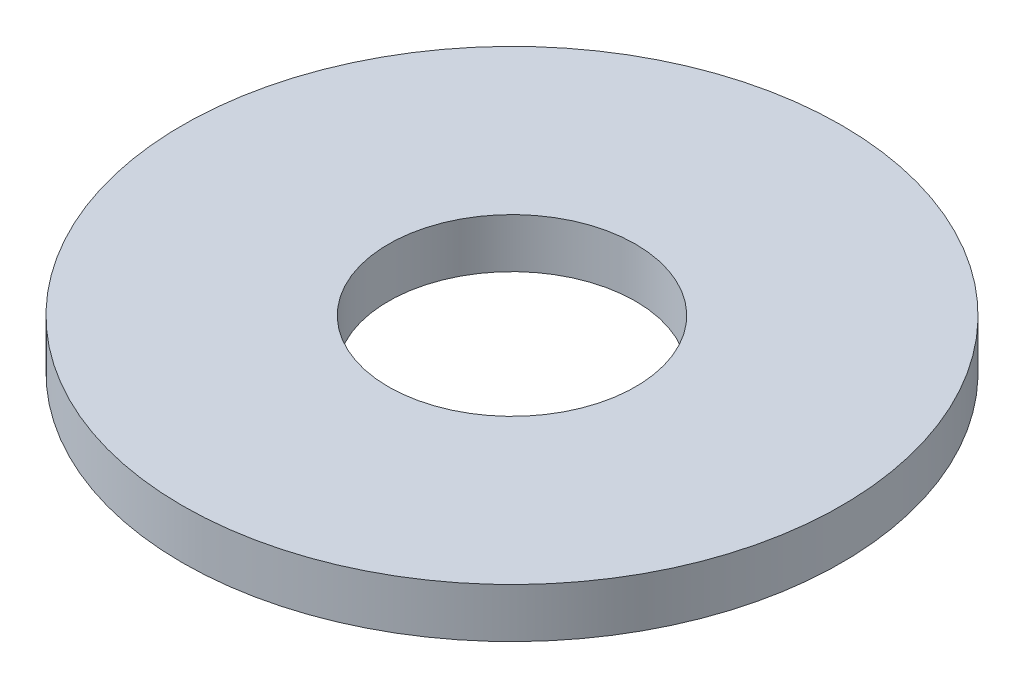
ISO-10303-21;
HEADER;
FILE_DESCRIPTION(('STEP AP214'),'2;1');
FILE_NAME('part.step','',(''),(''),'','','');
FILE_SCHEMA(('AUTOMOTIVE_DESIGN { 1 0 10303 214 1 1 1 1 }'));
ENDSEC;
DATA;
#1=APPLICATION_CONTEXT('core data for automotive mechanical design processes');
#2=APPLICATION_PROTOCOL_DEFINITION('international standard','automotive_design',2000,#1);
#3=PRODUCT_CONTEXT('',#1,'mechanical');
#4=PRODUCT('Part','Part','',(#3));
#5=PRODUCT_RELATED_PRODUCT_CATEGORY('part','',(#4));
#6=PRODUCT_DEFINITION_FORMATION('','',#4);
#7=PRODUCT_DEFINITION_CONTEXT('part definition',#1,'design');
#8=PRODUCT_DEFINITION('design','',#6,#7);
#9=PRODUCT_DEFINITION_SHAPE('','',#8);
#10=(LENGTH_UNIT() NAMED_UNIT(*) SI_UNIT(.MILLI.,.METRE.));
#11=(NAMED_UNIT(*) PLANE_ANGLE_UNIT() SI_UNIT($,.RADIAN.));
#12=(NAMED_UNIT(*) SI_UNIT($,.STERADIAN.) SOLID_ANGLE_UNIT());
#13=UNCERTAINTY_MEASURE_WITH_UNIT(LENGTH_MEASURE(1.E-05),#10,'distance_accuracy_value','');
#14=(GEOMETRIC_REPRESENTATION_CONTEXT(3) GLOBAL_UNCERTAINTY_ASSIGNED_CONTEXT((#13)) GLOBAL_UNIT_ASSIGNED_CONTEXT((#10,
#11,#12)) REPRESENTATION_CONTEXT('',''));
#15=CARTESIAN_POINT('',(0.,0.,0.));
#16=DIRECTION('',(0.,0.,1.));
#17=DIRECTION('',(1.,0.,0.));
#18=AXIS2_PLACEMENT_3D('',#15,#16,#17);
#19=CARTESIAN_POINT('',(0.,3.,0.));
#20=DIRECTION('',(0.,1.,0.));
#21=DIRECTION('',(0.,0.,1.));
#22=AXIS2_PLACEMENT_3D('',#19,#20,#21);
#23=PLANE('',#22);
#24=CARTESIAN_POINT('',(0.,3.,0.));
#25=DIRECTION('',(0.,1.,0.));
#26=DIRECTION('',(0.,0.,1.));
#27=AXIS2_PLACEMENT_3D('',#24,#25,#26);
#28=CIRCLE('',#27,20.);
#29=CARTESIAN_POINT('',(0.,3.,20.));
#30=VERTEX_POINT('',#29);
#31=EDGE_CURVE('E10',#30,#30,#28,.T.);
#32=ORIENTED_EDGE('',*,*,#31,.T.);
#33=EDGE_LOOP('',(#32));
#34=FACE_BOUND('',#33,.T.);
#35=CARTESIAN_POINT('',(0.,3.,0.));
#36=DIRECTION('',(0.,1.,0.));
#37=DIRECTION('',(0.,0.,1.));
#38=AXIS2_PLACEMENT_3D('',#35,#36,#37);
#39=CIRCLE('',#38,7.5);
#40=CARTESIAN_POINT('',(0.,3.,7.5));
#41=VERTEX_POINT('',#40);
#42=EDGE_CURVE('E46',#41,#41,#39,.T.);
#43=ORIENTED_EDGE('',*,*,#42,.F.);
#44=EDGE_LOOP('',(#43));
#45=FACE_BOUND('',#44,.T.);
#46=ADVANCED_FACE('F35',(#34,#45),#23,.T.);
#47=CARTESIAN_POINT('',(0.,0.,0.));
#48=DIRECTION('',(0.,1.,0.));
#49=DIRECTION('',(0.,0.,1.));
#50=AXIS2_PLACEMENT_3D('',#47,#48,#49);
#51=PLANE('',#50);
#52=CARTESIAN_POINT('',(0.,0.,0.));
#53=DIRECTION('',(0.,1.,0.));
#54=DIRECTION('',(0.,0.,1.));
#55=AXIS2_PLACEMENT_3D('',#52,#53,#54);
#56=CIRCLE('',#55,20.);
#57=CARTESIAN_POINT('',(0.,0.,20.));
#58=VERTEX_POINT('',#57);
#59=EDGE_CURVE('E39',#58,#58,#56,.T.);
#60=ORIENTED_EDGE('',*,*,#59,.F.);
#61=EDGE_LOOP('',(#60));
#62=FACE_BOUND('',#61,.T.);
#63=CARTESIAN_POINT('',(0.,0.,0.));
#64=DIRECTION('',(0.,1.,0.));
#65=DIRECTION('',(0.,0.,1.));
#66=AXIS2_PLACEMENT_3D('',#63,#64,#65);
#67=CIRCLE('',#66,7.5);
#68=CARTESIAN_POINT('',(0.,0.,7.5));
#69=VERTEX_POINT('',#68);
#70=EDGE_CURVE('E48',#69,#69,#67,.T.);
#71=ORIENTED_EDGE('',*,*,#70,.T.);
#72=EDGE_LOOP('',(#71));
#73=FACE_BOUND('',#72,.T.);
#74=ADVANCED_FACE('F58',(#62,#73),#51,.F.);
#75=CARTESIAN_POINT('',(0.,3.,0.));
#76=DIRECTION('',(0.,-1.,0.));
#77=DIRECTION('',(0.,0.,-1.));
#78=AXIS2_PLACEMENT_3D('',#75,#76,#77);
#79=CYLINDRICAL_SURFACE('',#78,20.);
#80=ORIENTED_EDGE('',*,*,#31,.F.);
#81=EDGE_LOOP('',(#80));
#82=FACE_BOUND('',#81,.T.);
#83=ORIENTED_EDGE('',*,*,#59,.T.);
#84=EDGE_LOOP('',(#83));
#85=FACE_BOUND('',#84,.T.);
#86=ADVANCED_FACE('F37',(#82,#85),#79,.T.);
#87=CARTESIAN_POINT('',(0.,3.,0.));
#88=DIRECTION('',(0.,-1.,0.));
#89=DIRECTION('',(0.,0.,-1.));
#90=AXIS2_PLACEMENT_3D('',#87,#88,#89);
#91=CYLINDRICAL_SURFACE('',#90,7.5);
#92=ORIENTED_EDGE('',*,*,#42,.T.);
#93=EDGE_LOOP('',(#92));
#94=FACE_BOUND('',#93,.T.);
#95=ORIENTED_EDGE('',*,*,#70,.F.);
#96=EDGE_LOOP('',(#95));
#97=FACE_BOUND('',#96,.T.);
#98=ADVANCED_FACE('F54',(#94,#97),#91,.F.);
#99=CLOSED_SHELL('',(#46,#74,#86,#98));
#100=MANIFOLD_SOLID_BREP('B2',#99);
#101=ADVANCED_BREP_SHAPE_REPRESENTATION('',(#18,#100),#14);
#102=SHAPE_DEFINITION_REPRESENTATION(#9,#101);
ENDSEC;
END-ISO-10303-21;
